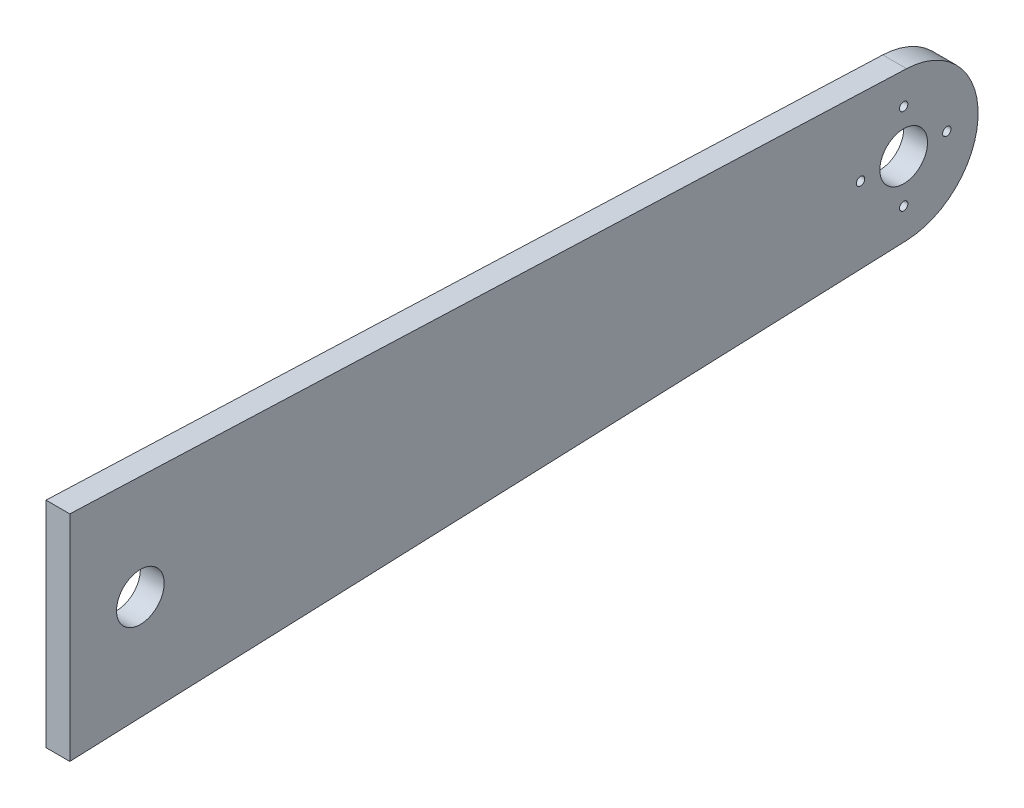
ISO-10303-21;
HEADER;
FILE_DESCRIPTION(('STEP AP214'),'2;1');
FILE_NAME('part.step','',(''),(''),'','','');
FILE_SCHEMA(('AUTOMOTIVE_DESIGN { 1 0 10303 214 1 1 1 1 }'));
ENDSEC;
DATA;
#1=APPLICATION_CONTEXT('core data for automotive mechanical design processes');
#2=APPLICATION_PROTOCOL_DEFINITION('international standard','automotive_design',2000,#1);
#3=PRODUCT_CONTEXT('',#1,'mechanical');
#4=PRODUCT('Part','Part','',(#3));
#5=PRODUCT_RELATED_PRODUCT_CATEGORY('part','',(#4));
#6=PRODUCT_DEFINITION_FORMATION('','',#4);
#7=PRODUCT_DEFINITION_CONTEXT('part definition',#1,'design');
#8=PRODUCT_DEFINITION('design','',#6,#7);
#9=PRODUCT_DEFINITION_SHAPE('','',#8);
#10=(LENGTH_UNIT() NAMED_UNIT(*) SI_UNIT(.MILLI.,.METRE.));
#11=(NAMED_UNIT(*) PLANE_ANGLE_UNIT() SI_UNIT($,.RADIAN.));
#12=(NAMED_UNIT(*) SI_UNIT($,.STERADIAN.) SOLID_ANGLE_UNIT());
#13=UNCERTAINTY_MEASURE_WITH_UNIT(LENGTH_MEASURE(1.E-05),#10,'distance_accuracy_value','');
#14=(GEOMETRIC_REPRESENTATION_CONTEXT(3) GLOBAL_UNCERTAINTY_ASSIGNED_CONTEXT((#13)) GLOBAL_UNIT_ASSIGNED_CONTEXT((#10,
#11,#12)) REPRESENTATION_CONTEXT('',''));
#15=CARTESIAN_POINT('',(0.,0.,0.));
#16=DIRECTION('',(0.,0.,1.));
#17=DIRECTION('',(1.,0.,0.));
#18=AXIS2_PLACEMENT_3D('',#15,#16,#17);
#19=CARTESIAN_POINT('',(4.,0.,0.));
#20=DIRECTION('',(1.,0.,0.));
#21=DIRECTION('',(0.,0.,-1.));
#22=AXIS2_PLACEMENT_3D('',#19,#20,#21);
#23=PLANE('',#22);
#24=CARTESIAN_POINT('',(4.,0.,128.158765470447));
#25=DIRECTION('',(1.,0.,0.));
#26=DIRECTION('',(0.,0.,-1.));
#27=AXIS2_PLACEMENT_3D('',#24,#25,#26);
#28=CIRCLE('',#27,4.00000000000001);
#29=CARTESIAN_POINT('',(4.,0.,124.158765470447));
#30=VERTEX_POINT('',#29);
#31=EDGE_CURVE('E171',#30,#30,#28,.T.);
#32=ORIENTED_EDGE('',*,*,#31,.F.);
#33=EDGE_LOOP('',(#32));
#34=FACE_BOUND('',#33,.T.);
#35=CARTESIAN_POINT('',(4.,0.,-7.24));
#36=DIRECTION('',(1.,0.,0.));
#37=DIRECTION('',(0.,0.,-1.));
#38=AXIS2_PLACEMENT_3D('',#35,#36,#37);
#39=CIRCLE('',#38,0.700000000000001);
#40=CARTESIAN_POINT('',(4.,0.,-7.94));
#41=VERTEX_POINT('',#40);
#42=EDGE_CURVE('E152',#41,#41,#39,.T.);
#43=ORIENTED_EDGE('',*,*,#42,.F.);
#44=EDGE_LOOP('',(#43));
#45=FACE_BOUND('',#44,.T.);
#46=CARTESIAN_POINT('',(4.,0.,7.24));
#47=DIRECTION('',(1.,0.,0.));
#48=DIRECTION('',(0.,0.,-1.));
#49=AXIS2_PLACEMENT_3D('',#46,#47,#48);
#50=CIRCLE('',#49,0.7);
#51=CARTESIAN_POINT('',(4.,0.,6.54));
#52=VERTEX_POINT('',#51);
#53=EDGE_CURVE('E136',#52,#52,#50,.T.);
#54=ORIENTED_EDGE('',*,*,#53,.F.);
#55=EDGE_LOOP('',(#54));
#56=FACE_BOUND('',#55,.T.);
#57=DIRECTION('',(0.,0.0391869580785532,0.999231896166525));
#58=VECTOR('',#57,1.);
#59=CARTESIAN_POINT('',(4.,18.,140.));
#60=LINE('',#59,#58);
#61=CARTESIAN_POINT('',(4.,12.4903987020816,-0.48983697598192));
#62=VERTEX_POINT('',#61);
#63=CARTESIAN_POINT('',(4.,18.,140.));
#64=VERTEX_POINT('',#63);
#65=EDGE_CURVE('E93',#62,#64,#60,.T.);
#66=ORIENTED_EDGE('',*,*,#65,.T.);
#67=DIRECTION('',(0.,-1.,0.));
#68=VECTOR('',#67,1.);
#69=CARTESIAN_POINT('',(4.,18.,140.));
#70=LINE('',#69,#68);
#71=CARTESIAN_POINT('',(4.,-18.,140.));
#72=VERTEX_POINT('',#71);
#73=EDGE_CURVE('E88',#64,#72,#70,.T.);
#74=ORIENTED_EDGE('',*,*,#73,.T.);
#75=DIRECTION('',(0.,0.0391869580785532,-0.999231896166525));
#76=VECTOR('',#75,1.);
#77=CARTESIAN_POINT('',(4.,-18.,140.));
#78=LINE('',#77,#76);
#79=CARTESIAN_POINT('',(4.,-12.4903987020816,-0.489836975981916));
#80=VERTEX_POINT('',#79);
#81=EDGE_CURVE('E91',#72,#80,#78,.T.);
#82=ORIENTED_EDGE('',*,*,#81,.T.);
#83=CARTESIAN_POINT('',(4.,0.,0.));
#84=DIRECTION('',(1.,0.,0.));
#85=DIRECTION('',(0.,0.,-1.));
#86=AXIS2_PLACEMENT_3D('',#83,#84,#85);
#87=CIRCLE('',#86,12.5);
#88=EDGE_CURVE('E58',#80,#62,#87,.T.);
#89=ORIENTED_EDGE('',*,*,#88,.T.);
#90=EDGE_LOOP('',(#66,#74,#82,#89));
#91=FACE_BOUND('',#90,.T.);
#92=CARTESIAN_POINT('',(4.,0.,0.));
#93=DIRECTION('',(1.,0.,0.));
#94=DIRECTION('',(0.,0.,-1.));
#95=AXIS2_PLACEMENT_3D('',#92,#93,#94);
#96=CIRCLE('',#95,4.);
#97=CARTESIAN_POINT('',(4.,0.,-4.));
#98=VERTEX_POINT('',#97);
#99=EDGE_CURVE('E114',#98,#98,#96,.T.);
#100=ORIENTED_EDGE('',*,*,#99,.F.);
#101=EDGE_LOOP('',(#100));
#102=FACE_BOUND('',#101,.T.);
#103=CARTESIAN_POINT('',(4.,7.24,0.));
#104=DIRECTION('',(1.,0.,0.));
#105=DIRECTION('',(0.,0.,-1.));
#106=AXIS2_PLACEMENT_3D('',#103,#104,#105);
#107=CIRCLE('',#106,0.7);
#108=CARTESIAN_POINT('',(4.,7.24,-0.699999999999999));
#109=VERTEX_POINT('',#108);
#110=EDGE_CURVE('E144',#109,#109,#107,.T.);
#111=ORIENTED_EDGE('',*,*,#110,.F.);
#112=EDGE_LOOP('',(#111));
#113=FACE_BOUND('',#112,.T.);
#114=CARTESIAN_POINT('',(4.,-7.24,0.));
#115=DIRECTION('',(1.,0.,0.));
#116=DIRECTION('',(0.,0.,-1.));
#117=AXIS2_PLACEMENT_3D('',#114,#115,#116);
#118=CIRCLE('',#117,0.7);
#119=CARTESIAN_POINT('',(4.,-7.24,-0.700000000000001));
#120=VERTEX_POINT('',#119);
#121=EDGE_CURVE('E160',#120,#120,#118,.T.);
#122=ORIENTED_EDGE('',*,*,#121,.F.);
#123=EDGE_LOOP('',(#122));
#124=FACE_BOUND('',#123,.T.);
#125=ADVANCED_FACE('F39',(#34,#45,#56,#91,#102,#113,#124),#23,.T.);
#126=CARTESIAN_POINT('',(0.,0.,0.));
#127=DIRECTION('',(1.,0.,0.));
#128=DIRECTION('',(0.,0.,-1.));
#129=AXIS2_PLACEMENT_3D('',#126,#127,#128);
#130=PLANE('',#129);
#131=CARTESIAN_POINT('',(0.,0.,128.158765470447));
#132=DIRECTION('',(1.,0.,0.));
#133=DIRECTION('',(0.,0.,-1.));
#134=AXIS2_PLACEMENT_3D('',#131,#132,#133);
#135=CIRCLE('',#134,4.00000000000001);
#136=CARTESIAN_POINT('',(0.,0.,124.158765470447));
#137=VERTEX_POINT('',#136);
#138=EDGE_CURVE('E43',#137,#137,#135,.T.);
#139=ORIENTED_EDGE('',*,*,#138,.T.);
#140=EDGE_LOOP('',(#139));
#141=FACE_BOUND('',#140,.T.);
#142=DIRECTION('',(0.,0.0391869580785532,0.999231896166525));
#143=VECTOR('',#142,1.);
#144=CARTESIAN_POINT('',(0.,18.,140.));
#145=LINE('',#144,#143);
#146=CARTESIAN_POINT('',(0.,12.4903987020816,-0.48983697598192));
#147=VERTEX_POINT('',#146);
#148=CARTESIAN_POINT('',(0.,18.,140.));
#149=VERTEX_POINT('',#148);
#150=EDGE_CURVE('E110',#147,#149,#145,.T.);
#151=ORIENTED_EDGE('',*,*,#150,.F.);
#152=CARTESIAN_POINT('',(0.,0.,0.));
#153=DIRECTION('',(1.,0.,0.));
#154=DIRECTION('',(0.,0.,-1.));
#155=AXIS2_PLACEMENT_3D('',#152,#153,#154);
#156=CIRCLE('',#155,12.5);
#157=CARTESIAN_POINT('',(0.,-12.4903987020816,-0.489836975981916));
#158=VERTEX_POINT('',#157);
#159=EDGE_CURVE('E81',#158,#147,#156,.T.);
#160=ORIENTED_EDGE('',*,*,#159,.F.);
#161=DIRECTION('',(0.,0.0391869580785532,-0.999231896166525));
#162=VECTOR('',#161,1.);
#163=CARTESIAN_POINT('',(0.,-18.,140.));
#164=LINE('',#163,#162);
#165=CARTESIAN_POINT('',(0.,-18.,140.));
#166=VERTEX_POINT('',#165);
#167=EDGE_CURVE('E75',#166,#158,#164,.T.);
#168=ORIENTED_EDGE('',*,*,#167,.F.);
#169=DIRECTION('',(0.,-1.,0.));
#170=VECTOR('',#169,1.);
#171=CARTESIAN_POINT('',(0.,18.,140.));
#172=LINE('',#171,#170);
#173=EDGE_CURVE('E98',#149,#166,#172,.T.);
#174=ORIENTED_EDGE('',*,*,#173,.F.);
#175=EDGE_LOOP('',(#151,#160,#168,#174));
#176=FACE_BOUND('',#175,.T.);
#177=CARTESIAN_POINT('',(0.,0.,0.));
#178=DIRECTION('',(1.,0.,0.));
#179=DIRECTION('',(0.,0.,-1.));
#180=AXIS2_PLACEMENT_3D('',#177,#178,#179);
#181=CIRCLE('',#180,4.);
#182=CARTESIAN_POINT('',(0.,0.,-4.));
#183=VERTEX_POINT('',#182);
#184=EDGE_CURVE('E132',#183,#183,#181,.T.);
#185=ORIENTED_EDGE('',*,*,#184,.T.);
#186=EDGE_LOOP('',(#185));
#187=FACE_BOUND('',#186,.T.);
#188=CARTESIAN_POINT('',(0.,0.,7.24));
#189=DIRECTION('',(1.,0.,0.));
#190=DIRECTION('',(0.,0.,-1.));
#191=AXIS2_PLACEMENT_3D('',#188,#189,#190);
#192=CIRCLE('',#191,0.7);
#193=CARTESIAN_POINT('',(0.,0.,6.54));
#194=VERTEX_POINT('',#193);
#195=EDGE_CURVE('E140',#194,#194,#192,.T.);
#196=ORIENTED_EDGE('',*,*,#195,.T.);
#197=EDGE_LOOP('',(#196));
#198=FACE_BOUND('',#197,.T.);
#199=CARTESIAN_POINT('',(0.,7.24,0.));
#200=DIRECTION('',(1.,0.,0.));
#201=DIRECTION('',(0.,0.,-1.));
#202=AXIS2_PLACEMENT_3D('',#199,#200,#201);
#203=CIRCLE('',#202,0.7);
#204=CARTESIAN_POINT('',(0.,7.24,-0.699999999999999));
#205=VERTEX_POINT('',#204);
#206=EDGE_CURVE('E148',#205,#205,#203,.T.);
#207=ORIENTED_EDGE('',*,*,#206,.T.);
#208=EDGE_LOOP('',(#207));
#209=FACE_BOUND('',#208,.T.);
#210=CARTESIAN_POINT('',(0.,0.,-7.24));
#211=DIRECTION('',(1.,0.,0.));
#212=DIRECTION('',(0.,0.,-1.));
#213=AXIS2_PLACEMENT_3D('',#210,#211,#212);
#214=CIRCLE('',#213,0.700000000000001);
#215=CARTESIAN_POINT('',(0.,0.,-7.94));
#216=VERTEX_POINT('',#215);
#217=EDGE_CURVE('E156',#216,#216,#214,.T.);
#218=ORIENTED_EDGE('',*,*,#217,.T.);
#219=EDGE_LOOP('',(#218));
#220=FACE_BOUND('',#219,.T.);
#221=CARTESIAN_POINT('',(0.,-7.24,0.));
#222=DIRECTION('',(1.,0.,0.));
#223=DIRECTION('',(0.,0.,-1.));
#224=AXIS2_PLACEMENT_3D('',#221,#222,#223);
#225=CIRCLE('',#224,0.7);
#226=CARTESIAN_POINT('',(0.,-7.24,-0.700000000000001));
#227=VERTEX_POINT('',#226);
#228=EDGE_CURVE('E164',#227,#227,#225,.T.);
#229=ORIENTED_EDGE('',*,*,#228,.T.);
#230=EDGE_LOOP('',(#229));
#231=FACE_BOUND('',#230,.T.);
#232=ADVANCED_FACE('F127',(#141,#176,#187,#198,#209,#220,#231),#130,.F.);
#233=CARTESIAN_POINT('',(4.,18.,140.));
#234=DIRECTION('',(0.,-0.999231896166525,0.0391869580785532));
#235=DIRECTION('',(0.,-0.0391869580785532,-0.999231896166526));
#236=AXIS2_PLACEMENT_3D('',#233,#234,#235);
#237=PLANE('',#236);
#238=ORIENTED_EDGE('',*,*,#150,.T.);
#239=DIRECTION('',(-1.,0.,0.));
#240=VECTOR('',#239,1.);
#241=CARTESIAN_POINT('',(4.,18.,140.));
#242=LINE('',#241,#240);
#243=EDGE_CURVE('E11',#64,#149,#242,.T.);
#244=ORIENTED_EDGE('',*,*,#243,.F.);
#245=ORIENTED_EDGE('',*,*,#65,.F.);
#246=DIRECTION('',(-1.,0.,0.));
#247=VECTOR('',#246,1.);
#248=CARTESIAN_POINT('',(4.,12.4903987020816,-0.48983697598192));
#249=LINE('',#248,#247);
#250=EDGE_CURVE('E106',#62,#147,#249,.T.);
#251=ORIENTED_EDGE('',*,*,#250,.T.);
#252=EDGE_LOOP('',(#238,#244,#245,#251));
#253=FACE_BOUND('',#252,.T.);
#254=ADVANCED_FACE('F41',(#253),#237,.F.);
#255=CARTESIAN_POINT('',(4.,18.,140.));
#256=DIRECTION('',(0.,0.,-1.));
#257=DIRECTION('',(-1.,0.,0.));
#258=AXIS2_PLACEMENT_3D('',#255,#256,#257);
#259=PLANE('',#258);
#260=ORIENTED_EDGE('',*,*,#173,.T.);
#261=DIRECTION('',(-1.,0.,0.));
#262=VECTOR('',#261,1.);
#263=CARTESIAN_POINT('',(4.,-18.,140.));
#264=LINE('',#263,#262);
#265=EDGE_CURVE('E50',#72,#166,#264,.T.);
#266=ORIENTED_EDGE('',*,*,#265,.F.);
#267=ORIENTED_EDGE('',*,*,#73,.F.);
#268=ORIENTED_EDGE('',*,*,#243,.T.);
#269=EDGE_LOOP('',(#260,#266,#267,#268));
#270=FACE_BOUND('',#269,.T.);
#271=ADVANCED_FACE('F97',(#270),#259,.F.);
#272=CARTESIAN_POINT('',(4.,-18.,140.));
#273=DIRECTION('',(0.,0.999231896166525,0.0391869580785532));
#274=DIRECTION('',(0.,-0.0391869580785532,0.999231896166526));
#275=AXIS2_PLACEMENT_3D('',#272,#273,#274);
#276=PLANE('',#275);
#277=ORIENTED_EDGE('',*,*,#167,.T.);
#278=DIRECTION('',(-1.,0.,0.));
#279=VECTOR('',#278,1.);
#280=CARTESIAN_POINT('',(4.,-12.4903987020816,-0.489836975981916));
#281=LINE('',#280,#279);
#282=EDGE_CURVE('E100',#80,#158,#281,.T.);
#283=ORIENTED_EDGE('',*,*,#282,.F.);
#284=ORIENTED_EDGE('',*,*,#81,.F.);
#285=ORIENTED_EDGE('',*,*,#265,.T.);
#286=EDGE_LOOP('',(#277,#283,#284,#285));
#287=FACE_BOUND('',#286,.T.);
#288=ADVANCED_FACE('F102',(#287),#276,.F.);
#289=CARTESIAN_POINT('',(4.,0.,0.));
#290=DIRECTION('',(-1.,0.,0.));
#291=DIRECTION('',(0.,0.,1.));
#292=AXIS2_PLACEMENT_3D('',#289,#290,#291);
#293=CYLINDRICAL_SURFACE('',#292,12.5);
#294=ORIENTED_EDGE('',*,*,#159,.T.);
#295=ORIENTED_EDGE('',*,*,#250,.F.);
#296=ORIENTED_EDGE('',*,*,#88,.F.);
#297=ORIENTED_EDGE('',*,*,#282,.T.);
#298=EDGE_LOOP('',(#294,#295,#296,#297));
#299=FACE_BOUND('',#298,.T.);
#300=ADVANCED_FACE('F124',(#299),#293,.T.);
#301=CARTESIAN_POINT('',(4.,0.,0.));
#302=DIRECTION('',(-1.,0.,0.));
#303=DIRECTION('',(0.,0.,1.));
#304=AXIS2_PLACEMENT_3D('',#301,#302,#303);
#305=CYLINDRICAL_SURFACE('',#304,4.);
#306=ORIENTED_EDGE('',*,*,#99,.T.);
#307=EDGE_LOOP('',(#306));
#308=FACE_BOUND('',#307,.T.);
#309=ORIENTED_EDGE('',*,*,#184,.F.);
#310=EDGE_LOOP('',(#309));
#311=FACE_BOUND('',#310,.T.);
#312=ADVANCED_FACE('F200',(#308,#311),#305,.F.);
#313=CARTESIAN_POINT('',(4.,0.,7.24));
#314=DIRECTION('',(-1.,0.,0.));
#315=DIRECTION('',(0.,0.,1.));
#316=AXIS2_PLACEMENT_3D('',#313,#314,#315);
#317=CYLINDRICAL_SURFACE('',#316,0.7);
#318=ORIENTED_EDGE('',*,*,#53,.T.);
#319=EDGE_LOOP('',(#318));
#320=FACE_BOUND('',#319,.T.);
#321=ORIENTED_EDGE('',*,*,#195,.F.);
#322=EDGE_LOOP('',(#321));
#323=FACE_BOUND('',#322,.T.);
#324=ADVANCED_FACE('F246',(#320,#323),#317,.F.);
#325=CARTESIAN_POINT('',(4.,7.24,0.));
#326=DIRECTION('',(-1.,0.,0.));
#327=DIRECTION('',(0.,0.,1.));
#328=AXIS2_PLACEMENT_3D('',#325,#326,#327);
#329=CYLINDRICAL_SURFACE('',#328,0.7);
#330=ORIENTED_EDGE('',*,*,#110,.T.);
#331=EDGE_LOOP('',(#330));
#332=FACE_BOUND('',#331,.T.);
#333=ORIENTED_EDGE('',*,*,#206,.F.);
#334=EDGE_LOOP('',(#333));
#335=FACE_BOUND('',#334,.T.);
#336=ADVANCED_FACE('F237',(#332,#335),#329,.F.);
#337=CARTESIAN_POINT('',(4.,0.,-7.24));
#338=DIRECTION('',(-1.,0.,0.));
#339=DIRECTION('',(0.,0.,1.));
#340=AXIS2_PLACEMENT_3D('',#337,#338,#339);
#341=CYLINDRICAL_SURFACE('',#340,0.700000000000001);
#342=ORIENTED_EDGE('',*,*,#42,.T.);
#343=EDGE_LOOP('',(#342));
#344=FACE_BOUND('',#343,.T.);
#345=ORIENTED_EDGE('',*,*,#217,.F.);
#346=EDGE_LOOP('',(#345));
#347=FACE_BOUND('',#346,.T.);
#348=ADVANCED_FACE('F188',(#344,#347),#341,.F.);
#349=CARTESIAN_POINT('',(4.,-7.24,0.));
#350=DIRECTION('',(-1.,0.,0.));
#351=DIRECTION('',(0.,0.,1.));
#352=AXIS2_PLACEMENT_3D('',#349,#350,#351);
#353=CYLINDRICAL_SURFACE('',#352,0.7);
#354=ORIENTED_EDGE('',*,*,#121,.T.);
#355=EDGE_LOOP('',(#354));
#356=FACE_BOUND('',#355,.T.);
#357=ORIENTED_EDGE('',*,*,#228,.F.);
#358=EDGE_LOOP('',(#357));
#359=FACE_BOUND('',#358,.T.);
#360=ADVANCED_FACE('F183',(#356,#359),#353,.F.);
#361=CARTESIAN_POINT('',(-6.,0.,128.158765470447));
#362=DIRECTION('',(1.,0.,0.));
#363=DIRECTION('',(0.,0.,-1.));
#364=AXIS2_PLACEMENT_3D('',#361,#362,#363);
#365=CYLINDRICAL_SURFACE('',#364,4.00000000000001);
#366=ORIENTED_EDGE('',*,*,#31,.T.);
#367=EDGE_LOOP('',(#366));
#368=FACE_BOUND('',#367,.T.);
#369=ORIENTED_EDGE('',*,*,#138,.F.);
#370=EDGE_LOOP('',(#369));
#371=FACE_BOUND('',#370,.T.);
#372=ADVANCED_FACE('F181',(#368,#371),#365,.F.);
#373=CLOSED_SHELL('',(#125,#232,#254,#271,#288,#300,#312,#324,#336,#348,#360,#372));
#374=MANIFOLD_SOLID_BREP('B2',#373);
#375=ADVANCED_BREP_SHAPE_REPRESENTATION('',(#18,#374),#14);
#376=SHAPE_DEFINITION_REPRESENTATION(#9,#375);
ENDSEC;
END-ISO-10303-21;
